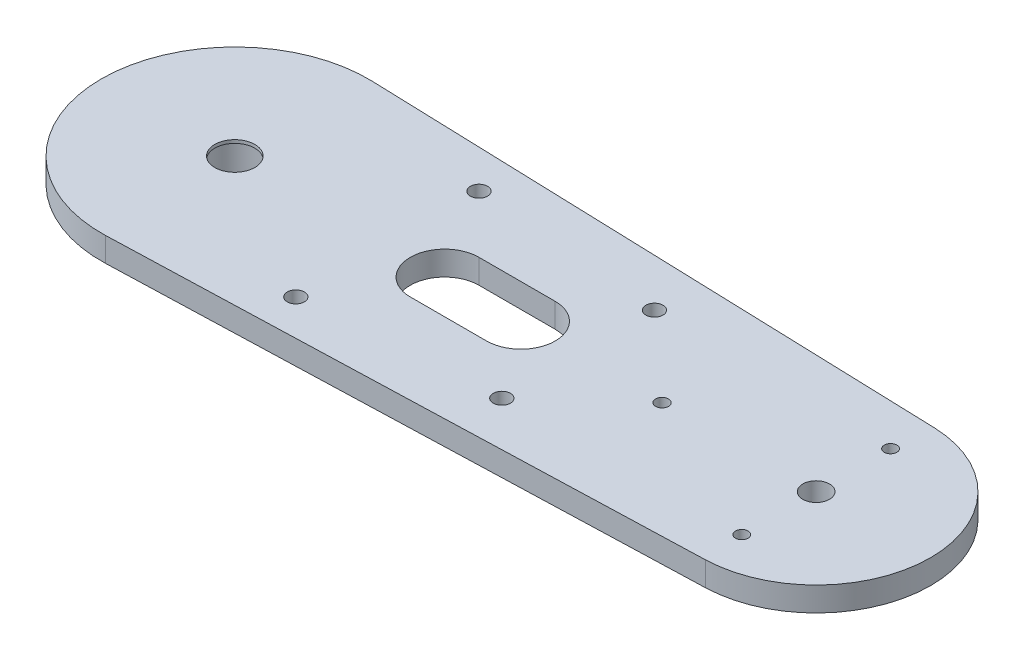
ISO-10303-21;
HEADER;
FILE_DESCRIPTION(('STEP AP214'),'2;1');
FILE_NAME('part.step','',(''),(''),'','','');
FILE_SCHEMA(('AUTOMOTIVE_DESIGN { 1 0 10303 214 1 1 1 1 }'));
ENDSEC;
DATA;
#1=APPLICATION_CONTEXT('core data for automotive mechanical design processes');
#2=APPLICATION_PROTOCOL_DEFINITION('international standard','automotive_design',2000,#1);
#3=PRODUCT_CONTEXT('',#1,'mechanical');
#4=PRODUCT('Part','Part','',(#3));
#5=PRODUCT_RELATED_PRODUCT_CATEGORY('part','',(#4));
#6=PRODUCT_DEFINITION_FORMATION('','',#4);
#7=PRODUCT_DEFINITION_CONTEXT('part definition',#1,'design');
#8=PRODUCT_DEFINITION('design','',#6,#7);
#9=PRODUCT_DEFINITION_SHAPE('','',#8);
#10=(LENGTH_UNIT() NAMED_UNIT(*) SI_UNIT(.MILLI.,.METRE.));
#11=(NAMED_UNIT(*) PLANE_ANGLE_UNIT() SI_UNIT($,.RADIAN.));
#12=(NAMED_UNIT(*) SI_UNIT($,.STERADIAN.) SOLID_ANGLE_UNIT());
#13=UNCERTAINTY_MEASURE_WITH_UNIT(LENGTH_MEASURE(1.E-05),#10,'distance_accuracy_value','');
#14=(GEOMETRIC_REPRESENTATION_CONTEXT(3) GLOBAL_UNCERTAINTY_ASSIGNED_CONTEXT((#13)) GLOBAL_UNIT_ASSIGNED_CONTEXT((#10,
#11,#12)) REPRESENTATION_CONTEXT('',''));
#15=CARTESIAN_POINT('',(0.,0.,0.));
#16=DIRECTION('',(0.,0.,1.));
#17=DIRECTION('',(1.,0.,0.));
#18=AXIS2_PLACEMENT_3D('',#15,#16,#17);
#19=CARTESIAN_POINT('',(0.,-4.,171.45));
#20=DIRECTION('',(0.,-1.,0.));
#21=DIRECTION('',(0.,0.,-1.));
#22=AXIS2_PLACEMENT_3D('',#19,#20,#21);
#23=CYLINDRICAL_SURFACE('',#22,5.25);
#24=CARTESIAN_POINT('',(0.,-4.,171.45));
#25=DIRECTION('',(0.,1.,0.));
#26=DIRECTION('',(0.,0.,1.));
#27=AXIS2_PLACEMENT_3D('',#24,#25,#26);
#28=CIRCLE('',#27,5.25);
#29=CARTESIAN_POINT('',(0.,-4.,176.7));
#30=VERTEX_POINT('',#29);
#31=EDGE_CURVE('E434',#30,#30,#28,.T.);
#32=ORIENTED_EDGE('',*,*,#31,.T.);
#33=EDGE_LOOP('',(#32));
#34=FACE_BOUND('',#33,.T.);
#35=CARTESIAN_POINT('',(0.,-4.85,171.45));
#36=DIRECTION('',(0.,-1.,0.));
#37=DIRECTION('',(0.,0.,-1.));
#38=AXIS2_PLACEMENT_3D('',#35,#36,#37);
#39=CIRCLE('',#38,5.25);
#40=CARTESIAN_POINT('',(0.,-4.85,166.2));
#41=VERTEX_POINT('',#40);
#42=EDGE_CURVE('E43',#41,#41,#39,.T.);
#43=ORIENTED_EDGE('',*,*,#42,.T.);
#44=EDGE_LOOP('',(#43));
#45=FACE_BOUND('',#44,.T.);
#46=ADVANCED_FACE('F39',(#34,#45),#23,.F.);
#47=CARTESIAN_POINT('',(0.,-4.,0.));
#48=DIRECTION('',(0.,1.,0.));
#49=DIRECTION('',(0.,0.,1.));
#50=AXIS2_PLACEMENT_3D('',#47,#48,#49);
#51=PLANE('',#50);
#52=CARTESIAN_POINT('',(112.,-4.,171.45));
#53=DIRECTION('',(0.,1.,0.));
#54=DIRECTION('',(0.,0.,1.));
#55=AXIS2_PLACEMENT_3D('',#52,#53,#54);
#56=CIRCLE('',#55,1.69999999999999);
#57=CARTESIAN_POINT('',(112.,-4.,173.15));
#58=VERTEX_POINT('',#57);
#59=EDGE_CURVE('E429',#58,#58,#56,.T.);
#60=ORIENTED_EDGE('',*,*,#59,.F.);
#61=EDGE_LOOP('',(#60));
#62=FACE_BOUND('',#61,.T.);
#63=ORIENTED_EDGE('',*,*,#31,.F.);
#64=EDGE_LOOP('',(#63));
#65=FACE_BOUND('',#64,.T.);
#66=CARTESIAN_POINT('',(152.4,-4.,171.45));
#67=DIRECTION('',(0.,1.,0.));
#68=DIRECTION('',(0.,0.,1.));
#69=AXIS2_PLACEMENT_3D('',#66,#67,#68);
#70=CIRCLE('',#69,3.49999999999999);
#71=CARTESIAN_POINT('',(152.4,-4.,174.95));
#72=VERTEX_POINT('',#71);
#73=EDGE_CURVE('E445',#72,#72,#70,.T.);
#74=ORIENTED_EDGE('',*,*,#73,.F.);
#75=EDGE_LOOP('',(#74));
#76=FACE_BOUND('',#75,.T.);
#77=CARTESIAN_POINT('',(152.4,-4.,190.95));
#78=DIRECTION('',(0.,1.,0.));
#79=DIRECTION('',(0.,0.,1.));
#80=AXIS2_PLACEMENT_3D('',#77,#78,#79);
#81=CIRCLE('',#80,1.65000000000002);
#82=CARTESIAN_POINT('',(152.4,-4.,192.6));
#83=VERTEX_POINT('',#82);
#84=EDGE_CURVE('E449',#83,#83,#81,.T.);
#85=ORIENTED_EDGE('',*,*,#84,.F.);
#86=EDGE_LOOP('',(#85));
#87=FACE_BOUND('',#86,.T.);
#88=CARTESIAN_POINT('',(152.4,-4.,151.95));
#89=DIRECTION('',(0.,1.,0.));
#90=DIRECTION('',(0.,0.,1.));
#91=AXIS2_PLACEMENT_3D('',#88,#89,#90);
#92=CIRCLE('',#91,1.65000000000002);
#93=CARTESIAN_POINT('',(152.4,-4.,153.6));
#94=VERTEX_POINT('',#93);
#95=EDGE_CURVE('E435',#94,#94,#92,.T.);
#96=ORIENTED_EDGE('',*,*,#95,.F.);
#97=EDGE_LOOP('',(#96));
#98=FACE_BOUND('',#97,.T.);
#99=CARTESIAN_POINT('',(40.,-4.,147.45));
#100=DIRECTION('',(0.,1.,0.));
#101=DIRECTION('',(0.,0.,1.));
#102=AXIS2_PLACEMENT_3D('',#99,#100,#101);
#103=CIRCLE('',#102,2.25);
#104=CARTESIAN_POINT('',(40.,-4.,149.7));
#105=VERTEX_POINT('',#104);
#106=EDGE_CURVE('E467',#105,#105,#103,.T.);
#107=ORIENTED_EDGE('',*,*,#106,.F.);
#108=EDGE_LOOP('',(#107));
#109=FACE_BOUND('',#108,.T.);
#110=CARTESIAN_POINT('',(90.,-4.,191.45));
#111=DIRECTION('',(0.,1.,0.));
#112=DIRECTION('',(0.,0.,1.));
#113=AXIS2_PLACEMENT_3D('',#110,#111,#112);
#114=CIRCLE('',#113,2.25);
#115=CARTESIAN_POINT('',(90.,-4.,193.7));
#116=VERTEX_POINT('',#115);
#117=EDGE_CURVE('E456',#116,#116,#114,.T.);
#118=ORIENTED_EDGE('',*,*,#117,.F.);
#119=EDGE_LOOP('',(#118));
#120=FACE_BOUND('',#119,.T.);
#121=CARTESIAN_POINT('',(90.,-4.,151.45));
#122=DIRECTION('',(0.,1.,0.));
#123=DIRECTION('',(0.,0.,1.));
#124=AXIS2_PLACEMENT_3D('',#121,#122,#123);
#125=CIRCLE('',#124,2.25);
#126=CARTESIAN_POINT('',(90.,-4.,153.7));
#127=VERTEX_POINT('',#126);
#128=EDGE_CURVE('E438',#127,#127,#125,.T.);
#129=ORIENTED_EDGE('',*,*,#128,.F.);
#130=EDGE_LOOP('',(#129));
#131=FACE_BOUND('',#130,.T.);
#132=CARTESIAN_POINT('',(40.,-4.,195.45));
#133=DIRECTION('',(0.,1.,0.));
#134=DIRECTION('',(0.,0.,1.));
#135=AXIS2_PLACEMENT_3D('',#132,#133,#134);
#136=CIRCLE('',#135,2.25);
#137=CARTESIAN_POINT('',(40.,-4.,197.7));
#138=VERTEX_POINT('',#137);
#139=EDGE_CURVE('E133',#138,#138,#136,.T.);
#140=ORIENTED_EDGE('',*,*,#139,.F.);
#141=EDGE_LOOP('',(#140));
#142=FACE_BOUND('',#141,.T.);
#143=DIRECTION('',(0.999461659573957,0.,-0.0328083989501311));
#144=VECTOR('',#143,1.);
#145=CARTESIAN_POINT('',(1.14829396325459,-4.,206.431158085088));
#146=LINE('',#145,#144);
#147=CARTESIAN_POINT('',(1.14829396325459,-4.,206.431158085088));
#148=VERTEX_POINT('',#147);
#149=CARTESIAN_POINT('',(153.384251968504,-4.,201.433849787219));
#150=VERTEX_POINT('',#149);
#151=EDGE_CURVE('E157',#148,#150,#146,.T.);
#152=ORIENTED_EDGE('',*,*,#151,.T.);
#153=CARTESIAN_POINT('',(152.4,-4.,171.45));
#154=DIRECTION('',(0.,1.,0.));
#155=DIRECTION('',(0.,0.,1.));
#156=AXIS2_PLACEMENT_3D('',#153,#154,#155);
#157=CIRCLE('',#156,30.);
#158=CARTESIAN_POINT('',(153.384251968504,-4.,141.466150212781));
#159=VERTEX_POINT('',#158);
#160=EDGE_CURVE('E143',#150,#159,#157,.T.);
#161=ORIENTED_EDGE('',*,*,#160,.T.);
#162=DIRECTION('',(-0.999461659573957,0.,-0.0328083989501311));
#163=VECTOR('',#162,1.);
#164=CARTESIAN_POINT('',(153.384251968504,-4.,141.466150212781));
#165=LINE('',#164,#163);
#166=CARTESIAN_POINT('',(1.14829396325459,-4.,136.468841914911));
#167=VERTEX_POINT('',#166);
#168=EDGE_CURVE('E156',#159,#167,#165,.T.);
#169=ORIENTED_EDGE('',*,*,#168,.T.);
#170=CARTESIAN_POINT('',(0.,-4.,171.45));
#171=DIRECTION('',(0.,1.,0.));
#172=DIRECTION('',(0.,0.,1.));
#173=AXIS2_PLACEMENT_3D('',#170,#171,#172);
#174=CIRCLE('',#173,35.);
#175=EDGE_CURVE('E146',#167,#148,#174,.T.);
#176=ORIENTED_EDGE('',*,*,#175,.T.);
#177=EDGE_LOOP('',(#152,#161,#169,#176));
#178=FACE_BOUND('',#177,.T.);
#179=DIRECTION('',(1.,0.,0.));
#180=VECTOR('',#179,1.);
#181=CARTESIAN_POINT('',(75.,-4.,180.45));
#182=LINE('',#181,#180);
#183=CARTESIAN_POINT('',(55.,-4.,180.45));
#184=VERTEX_POINT('',#183);
#185=CARTESIAN_POINT('',(75.,-4.,180.45));
#186=VERTEX_POINT('',#185);
#187=EDGE_CURVE('E112',#184,#186,#182,.T.);
#188=ORIENTED_EDGE('',*,*,#187,.F.);
#189=CARTESIAN_POINT('',(55.,-4.,171.45));
#190=DIRECTION('',(0.,1.,0.));
#191=DIRECTION('',(0.,0.,-1.));
#192=AXIS2_PLACEMENT_3D('',#189,#190,#191);
#193=CIRCLE('',#192,9.00000000000001);
#194=CARTESIAN_POINT('',(55.,-4.,162.45));
#195=VERTEX_POINT('',#194);
#196=EDGE_CURVE('E106',#195,#184,#193,.T.);
#197=ORIENTED_EDGE('',*,*,#196,.F.);
#198=DIRECTION('',(-1.,0.,0.));
#199=VECTOR('',#198,1.);
#200=CARTESIAN_POINT('',(55.,-4.,162.45));
#201=LINE('',#200,#199);
#202=CARTESIAN_POINT('',(75.,-4.,162.45));
#203=VERTEX_POINT('',#202);
#204=EDGE_CURVE('E130',#203,#195,#201,.T.);
#205=ORIENTED_EDGE('',*,*,#204,.F.);
#206=CARTESIAN_POINT('',(75.,-4.,171.45));
#207=DIRECTION('',(0.,1.,0.));
#208=DIRECTION('',(0.,0.,-1.));
#209=AXIS2_PLACEMENT_3D('',#206,#207,#208);
#210=CIRCLE('',#209,9.00000000000001);
#211=EDGE_CURVE('E129',#186,#203,#210,.T.);
#212=ORIENTED_EDGE('',*,*,#211,.F.);
#213=EDGE_LOOP('',(#188,#197,#205,#212));
#214=FACE_BOUND('',#213,.T.);
#215=ADVANCED_FACE('F128',(#62,#65,#76,#87,#98,#109,#120,#131,#142,#178,#214),#51,.T.);
#216=CARTESIAN_POINT('',(0.,-10.35,0.));
#217=DIRECTION('',(0.,1.,0.));
#218=DIRECTION('',(0.,0.,1.));
#219=AXIS2_PLACEMENT_3D('',#216,#217,#218);
#220=PLANE('',#219);
#221=CARTESIAN_POINT('',(0.,-10.35,171.45));
#222=DIRECTION('',(0.,-1.,0.));
#223=DIRECTION('',(0.,0.,-1.));
#224=AXIS2_PLACEMENT_3D('',#221,#222,#223);
#225=CIRCLE('',#224,10.);
#226=CARTESIAN_POINT('',(0.,-10.35,161.45));
#227=VERTEX_POINT('',#226);
#228=EDGE_CURVE('E11',#227,#227,#225,.T.);
#229=ORIENTED_EDGE('',*,*,#228,.F.);
#230=EDGE_LOOP('',(#229));
#231=FACE_BOUND('',#230,.T.);
#232=CARTESIAN_POINT('',(112.,-10.35,171.45));
#233=DIRECTION('',(0.,1.,0.));
#234=DIRECTION('',(0.,0.,1.));
#235=AXIS2_PLACEMENT_3D('',#232,#233,#234);
#236=CIRCLE('',#235,1.69999999999999);
#237=CARTESIAN_POINT('',(112.,-10.35,173.15));
#238=VERTEX_POINT('',#237);
#239=EDGE_CURVE('E430',#238,#238,#236,.T.);
#240=ORIENTED_EDGE('',*,*,#239,.T.);
#241=EDGE_LOOP('',(#240));
#242=FACE_BOUND('',#241,.T.);
#243=CARTESIAN_POINT('',(152.4,-10.35,171.45));
#244=DIRECTION('',(0.,1.,0.));
#245=DIRECTION('',(0.,0.,1.));
#246=AXIS2_PLACEMENT_3D('',#243,#244,#245);
#247=CIRCLE('',#246,3.49999999999999);
#248=CARTESIAN_POINT('',(152.4,-10.35,174.95));
#249=VERTEX_POINT('',#248);
#250=EDGE_CURVE('E437',#249,#249,#247,.T.);
#251=ORIENTED_EDGE('',*,*,#250,.T.);
#252=EDGE_LOOP('',(#251));
#253=FACE_BOUND('',#252,.T.);
#254=CARTESIAN_POINT('',(152.4,-10.35,190.95));
#255=DIRECTION('',(0.,1.,0.));
#256=DIRECTION('',(0.,0.,1.));
#257=AXIS2_PLACEMENT_3D('',#254,#255,#256);
#258=CIRCLE('',#257,1.65000000000002);
#259=CARTESIAN_POINT('',(152.4,-10.35,192.6));
#260=VERTEX_POINT('',#259);
#261=EDGE_CURVE('E444',#260,#260,#258,.T.);
#262=ORIENTED_EDGE('',*,*,#261,.T.);
#263=EDGE_LOOP('',(#262));
#264=FACE_BOUND('',#263,.T.);
#265=CARTESIAN_POINT('',(152.4,-10.35,151.95));
#266=DIRECTION('',(0.,1.,0.));
#267=DIRECTION('',(0.,0.,1.));
#268=AXIS2_PLACEMENT_3D('',#265,#266,#267);
#269=CIRCLE('',#268,1.65000000000002);
#270=CARTESIAN_POINT('',(152.4,-10.35,153.6));
#271=VERTEX_POINT('',#270);
#272=EDGE_CURVE('E453',#271,#271,#269,.T.);
#273=ORIENTED_EDGE('',*,*,#272,.T.);
#274=EDGE_LOOP('',(#273));
#275=FACE_BOUND('',#274,.T.);
#276=CARTESIAN_POINT('',(40.,-10.35,147.45));
#277=DIRECTION('',(0.,1.,0.));
#278=DIRECTION('',(0.,0.,1.));
#279=AXIS2_PLACEMENT_3D('',#276,#277,#278);
#280=CIRCLE('',#279,2.25);
#281=CARTESIAN_POINT('',(40.,-10.35,149.7));
#282=VERTEX_POINT('',#281);
#283=EDGE_CURVE('E465',#282,#282,#280,.T.);
#284=ORIENTED_EDGE('',*,*,#283,.T.);
#285=EDGE_LOOP('',(#284));
#286=FACE_BOUND('',#285,.T.);
#287=CARTESIAN_POINT('',(90.,-10.35,191.45));
#288=DIRECTION('',(0.,1.,0.));
#289=DIRECTION('',(0.,0.,1.));
#290=AXIS2_PLACEMENT_3D('',#287,#288,#289);
#291=CIRCLE('',#290,2.25);
#292=CARTESIAN_POINT('',(90.,-10.35,193.7));
#293=VERTEX_POINT('',#292);
#294=EDGE_CURVE('E469',#293,#293,#291,.T.);
#295=ORIENTED_EDGE('',*,*,#294,.T.);
#296=EDGE_LOOP('',(#295));
#297=FACE_BOUND('',#296,.T.);
#298=CARTESIAN_POINT('',(90.,-10.35,151.45));
#299=DIRECTION('',(0.,1.,0.));
#300=DIRECTION('',(0.,0.,1.));
#301=AXIS2_PLACEMENT_3D('',#298,#299,#300);
#302=CIRCLE('',#301,2.25);
#303=CARTESIAN_POINT('',(90.,-10.35,153.7));
#304=VERTEX_POINT('',#303);
#305=EDGE_CURVE('E457',#304,#304,#302,.T.);
#306=ORIENTED_EDGE('',*,*,#305,.T.);
#307=EDGE_LOOP('',(#306));
#308=FACE_BOUND('',#307,.T.);
#309=CARTESIAN_POINT('',(40.,-10.35,195.45));
#310=DIRECTION('',(0.,1.,0.));
#311=DIRECTION('',(0.,0.,1.));
#312=AXIS2_PLACEMENT_3D('',#309,#310,#311);
#313=CIRCLE('',#312,2.25);
#314=CARTESIAN_POINT('',(40.,-10.35,197.7));
#315=VERTEX_POINT('',#314);
#316=EDGE_CURVE('E463',#315,#315,#313,.T.);
#317=ORIENTED_EDGE('',*,*,#316,.T.);
#318=EDGE_LOOP('',(#317));
#319=FACE_BOUND('',#318,.T.);
#320=DIRECTION('',(-0.999461659573957,0.,-0.0328083989501311));
#321=VECTOR('',#320,1.);
#322=CARTESIAN_POINT('',(153.384251968504,-10.35,141.466150212781));
#323=LINE('',#322,#321);
#324=CARTESIAN_POINT('',(153.384251968504,-10.35,141.466150212781));
#325=VERTEX_POINT('',#324);
#326=CARTESIAN_POINT('',(1.14829396325459,-10.35,136.468841914911));
#327=VERTEX_POINT('',#326);
#328=EDGE_CURVE('E158',#325,#327,#323,.T.);
#329=ORIENTED_EDGE('',*,*,#328,.F.);
#330=CARTESIAN_POINT('',(152.4,-10.35,171.45));
#331=DIRECTION('',(0.,1.,0.));
#332=DIRECTION('',(0.,0.,1.));
#333=AXIS2_PLACEMENT_3D('',#330,#331,#332);
#334=CIRCLE('',#333,30.);
#335=CARTESIAN_POINT('',(153.384251968504,-10.35,201.433849787219));
#336=VERTEX_POINT('',#335);
#337=EDGE_CURVE('E125',#336,#325,#334,.T.);
#338=ORIENTED_EDGE('',*,*,#337,.F.);
#339=DIRECTION('',(0.999461659573957,0.,-0.0328083989501311));
#340=VECTOR('',#339,1.);
#341=CARTESIAN_POINT('',(1.14829396325459,-10.35,206.431158085088));
#342=LINE('',#341,#340);
#343=CARTESIAN_POINT('',(1.14829396325459,-10.35,206.431158085088));
#344=VERTEX_POINT('',#343);
#345=EDGE_CURVE('E154',#344,#336,#342,.T.);
#346=ORIENTED_EDGE('',*,*,#345,.F.);
#347=CARTESIAN_POINT('',(0.,-10.35,171.45));
#348=DIRECTION('',(0.,1.,0.));
#349=DIRECTION('',(0.,0.,1.));
#350=AXIS2_PLACEMENT_3D('',#347,#348,#349);
#351=CIRCLE('',#350,35.);
#352=EDGE_CURVE('E147',#327,#344,#351,.T.);
#353=ORIENTED_EDGE('',*,*,#352,.F.);
#354=EDGE_LOOP('',(#329,#338,#346,#353));
#355=FACE_BOUND('',#354,.T.);
#356=CARTESIAN_POINT('',(55.,-10.35,171.45));
#357=DIRECTION('',(0.,1.,0.));
#358=DIRECTION('',(0.,0.,-1.));
#359=AXIS2_PLACEMENT_3D('',#356,#357,#358);
#360=CIRCLE('',#359,9.00000000000001);
#361=CARTESIAN_POINT('',(55.,-10.35,162.45));
#362=VERTEX_POINT('',#361);
#363=CARTESIAN_POINT('',(55.,-10.35,180.45));
#364=VERTEX_POINT('',#363);
#365=EDGE_CURVE('E65',#362,#364,#360,.T.);
#366=ORIENTED_EDGE('',*,*,#365,.T.);
#367=DIRECTION('',(1.,0.,0.));
#368=VECTOR('',#367,1.);
#369=CARTESIAN_POINT('',(75.,-10.35,180.45));
#370=LINE('',#369,#368);
#371=CARTESIAN_POINT('',(75.,-10.35,180.45));
#372=VERTEX_POINT('',#371);
#373=EDGE_CURVE('E122',#364,#372,#370,.T.);
#374=ORIENTED_EDGE('',*,*,#373,.T.);
#375=CARTESIAN_POINT('',(75.,-10.35,171.45));
#376=DIRECTION('',(0.,1.,0.));
#377=DIRECTION('',(0.,0.,-1.));
#378=AXIS2_PLACEMENT_3D('',#375,#376,#377);
#379=CIRCLE('',#378,9.00000000000001);
#380=CARTESIAN_POINT('',(75.,-10.35,162.45));
#381=VERTEX_POINT('',#380);
#382=EDGE_CURVE('E140',#372,#381,#379,.T.);
#383=ORIENTED_EDGE('',*,*,#382,.T.);
#384=DIRECTION('',(-1.,0.,0.));
#385=VECTOR('',#384,1.);
#386=CARTESIAN_POINT('',(55.,-10.35,162.45));
#387=LINE('',#386,#385);
#388=EDGE_CURVE('E114',#381,#362,#387,.T.);
#389=ORIENTED_EDGE('',*,*,#388,.T.);
#390=EDGE_LOOP('',(#366,#374,#383,#389));
#391=FACE_BOUND('',#390,.T.);
#392=ADVANCED_FACE('F182',(#231,#242,#253,#264,#275,#286,#297,#308,#319,#355,#391),#220,.F.);
#393=CARTESIAN_POINT('',(1.14829396325459,-4.,206.431158085088));
#394=DIRECTION('',(-0.0328083989501311,0.,-0.999461659573957));
#395=DIRECTION('',(-0.999461659573957,0.,0.0328083989501311));
#396=AXIS2_PLACEMENT_3D('',#393,#394,#395);
#397=PLANE('',#396);
#398=ORIENTED_EDGE('',*,*,#345,.T.);
#399=DIRECTION('',(0.,-1.,0.));
#400=VECTOR('',#399,1.);
#401=CARTESIAN_POINT('',(153.384251968504,-4.,201.433849787219));
#402=LINE('',#401,#400);
#403=EDGE_CURVE('E171',#150,#336,#402,.T.);
#404=ORIENTED_EDGE('',*,*,#403,.F.);
#405=ORIENTED_EDGE('',*,*,#151,.F.);
#406=DIRECTION('',(0.,-1.,0.));
#407=VECTOR('',#406,1.);
#408=CARTESIAN_POINT('',(1.14829396325459,-4.,206.431158085088));
#409=LINE('',#408,#407);
#410=EDGE_CURVE('E48',#148,#344,#409,.T.);
#411=ORIENTED_EDGE('',*,*,#410,.T.);
#412=EDGE_LOOP('',(#398,#404,#405,#411));
#413=FACE_BOUND('',#412,.T.);
#414=ADVANCED_FACE('F41',(#413),#397,.F.);
#415=CARTESIAN_POINT('',(153.384251968504,-4.,141.466150212781));
#416=DIRECTION('',(-0.0328083989501311,0.,0.999461659573957));
#417=DIRECTION('',(0.999461659573957,0.,0.0328083989501311));
#418=AXIS2_PLACEMENT_3D('',#415,#416,#417);
#419=PLANE('',#418);
#420=ORIENTED_EDGE('',*,*,#328,.T.);
#421=DIRECTION('',(0.,-1.,0.));
#422=VECTOR('',#421,1.);
#423=CARTESIAN_POINT('',(1.14829396325459,-4.,136.468841914911));
#424=LINE('',#423,#422);
#425=EDGE_CURVE('E162',#167,#327,#424,.T.);
#426=ORIENTED_EDGE('',*,*,#425,.F.);
#427=ORIENTED_EDGE('',*,*,#168,.F.);
#428=DIRECTION('',(0.,-1.,0.));
#429=VECTOR('',#428,1.);
#430=CARTESIAN_POINT('',(153.384251968504,-4.,141.466150212781));
#431=LINE('',#430,#429);
#432=EDGE_CURVE('E166',#159,#325,#431,.T.);
#433=ORIENTED_EDGE('',*,*,#432,.T.);
#434=EDGE_LOOP('',(#420,#426,#427,#433));
#435=FACE_BOUND('',#434,.T.);
#436=ADVANCED_FACE('F188',(#435),#419,.F.);
#437=CARTESIAN_POINT('',(0.,-4.,171.45));
#438=DIRECTION('',(0.,-1.,0.));
#439=DIRECTION('',(0.,0.,-1.));
#440=AXIS2_PLACEMENT_3D('',#437,#438,#439);
#441=CYLINDRICAL_SURFACE('',#440,35.);
#442=ORIENTED_EDGE('',*,*,#352,.T.);
#443=ORIENTED_EDGE('',*,*,#410,.F.);
#444=ORIENTED_EDGE('',*,*,#175,.F.);
#445=ORIENTED_EDGE('',*,*,#425,.T.);
#446=EDGE_LOOP('',(#442,#443,#444,#445));
#447=FACE_BOUND('',#446,.T.);
#448=ADVANCED_FACE('F177',(#447),#441,.T.);
#449=CARTESIAN_POINT('',(152.4,-4.,171.45));
#450=DIRECTION('',(0.,-1.,0.));
#451=DIRECTION('',(0.,0.,-1.));
#452=AXIS2_PLACEMENT_3D('',#449,#450,#451);
#453=CYLINDRICAL_SURFACE('',#452,30.);
#454=ORIENTED_EDGE('',*,*,#160,.F.);
#455=ORIENTED_EDGE('',*,*,#403,.T.);
#456=ORIENTED_EDGE('',*,*,#337,.T.);
#457=ORIENTED_EDGE('',*,*,#432,.F.);
#458=EDGE_LOOP('',(#454,#455,#456,#457));
#459=FACE_BOUND('',#458,.T.);
#460=ADVANCED_FACE('F190',(#459),#453,.T.);
#461=CARTESIAN_POINT('',(55.,-4.,171.45));
#462=DIRECTION('',(0.,-1.,0.));
#463=DIRECTION('',(0.,0.,-1.));
#464=AXIS2_PLACEMENT_3D('',#461,#462,#463);
#465=CYLINDRICAL_SURFACE('',#464,9.00000000000001);
#466=ORIENTED_EDGE('',*,*,#365,.F.);
#467=DIRECTION('',(0.,-1.,0.));
#468=VECTOR('',#467,1.);
#469=CARTESIAN_POINT('',(55.,-4.,162.45));
#470=LINE('',#469,#468);
#471=EDGE_CURVE('E109',#195,#362,#470,.T.);
#472=ORIENTED_EDGE('',*,*,#471,.F.);
#473=ORIENTED_EDGE('',*,*,#196,.T.);
#474=DIRECTION('',(0.,-1.,0.));
#475=VECTOR('',#474,1.);
#476=CARTESIAN_POINT('',(55.,-4.,180.45));
#477=LINE('',#476,#475);
#478=EDGE_CURVE('E107',#184,#364,#477,.T.);
#479=ORIENTED_EDGE('',*,*,#478,.T.);
#480=EDGE_LOOP('',(#466,#472,#473,#479));
#481=FACE_BOUND('',#480,.T.);
#482=ADVANCED_FACE('F108',(#481),#465,.F.);
#483=CARTESIAN_POINT('',(75.,-4.,180.45));
#484=DIRECTION('',(0.,0.,-1.));
#485=DIRECTION('',(-1.,0.,0.));
#486=AXIS2_PLACEMENT_3D('',#483,#484,#485);
#487=PLANE('',#486);
#488=ORIENTED_EDGE('',*,*,#373,.F.);
#489=ORIENTED_EDGE('',*,*,#478,.F.);
#490=ORIENTED_EDGE('',*,*,#187,.T.);
#491=DIRECTION('',(0.,-1.,0.));
#492=VECTOR('',#491,1.);
#493=CARTESIAN_POINT('',(75.,-4.,180.45));
#494=LINE('',#493,#492);
#495=EDGE_CURVE('E124',#186,#372,#494,.T.);
#496=ORIENTED_EDGE('',*,*,#495,.T.);
#497=EDGE_LOOP('',(#488,#489,#490,#496));
#498=FACE_BOUND('',#497,.T.);
#499=ADVANCED_FACE('F117',(#498),#487,.T.);
#500=CARTESIAN_POINT('',(75.,-4.,171.45));
#501=DIRECTION('',(0.,-1.,0.));
#502=DIRECTION('',(0.,0.,-1.));
#503=AXIS2_PLACEMENT_3D('',#500,#501,#502);
#504=CYLINDRICAL_SURFACE('',#503,9.00000000000001);
#505=ORIENTED_EDGE('',*,*,#382,.F.);
#506=ORIENTED_EDGE('',*,*,#495,.F.);
#507=ORIENTED_EDGE('',*,*,#211,.T.);
#508=DIRECTION('',(0.,-1.,0.));
#509=VECTOR('',#508,1.);
#510=CARTESIAN_POINT('',(75.,-4.,162.45));
#511=LINE('',#510,#509);
#512=EDGE_CURVE('E57',#203,#381,#511,.T.);
#513=ORIENTED_EDGE('',*,*,#512,.T.);
#514=EDGE_LOOP('',(#505,#506,#507,#513));
#515=FACE_BOUND('',#514,.T.);
#516=ADVANCED_FACE('F268',(#515),#504,.F.);
#517=CARTESIAN_POINT('',(55.,-4.,162.45));
#518=DIRECTION('',(0.,0.,1.));
#519=DIRECTION('',(1.,0.,0.));
#520=AXIS2_PLACEMENT_3D('',#517,#518,#519);
#521=PLANE('',#520);
#522=ORIENTED_EDGE('',*,*,#388,.F.);
#523=ORIENTED_EDGE('',*,*,#512,.F.);
#524=ORIENTED_EDGE('',*,*,#204,.T.);
#525=ORIENTED_EDGE('',*,*,#471,.T.);
#526=EDGE_LOOP('',(#522,#523,#524,#525));
#527=FACE_BOUND('',#526,.T.);
#528=ADVANCED_FACE('F280',(#527),#521,.T.);
#529=CARTESIAN_POINT('',(40.,-4.,195.45));
#530=DIRECTION('',(0.,-1.,0.));
#531=DIRECTION('',(0.,0.,-1.));
#532=AXIS2_PLACEMENT_3D('',#529,#530,#531);
#533=CYLINDRICAL_SURFACE('',#532,2.25);
#534=ORIENTED_EDGE('',*,*,#139,.T.);
#535=EDGE_LOOP('',(#534));
#536=FACE_BOUND('',#535,.T.);
#537=ORIENTED_EDGE('',*,*,#316,.F.);
#538=EDGE_LOOP('',(#537));
#539=FACE_BOUND('',#538,.T.);
#540=ADVANCED_FACE('F286',(#536,#539),#533,.F.);
#541=CARTESIAN_POINT('',(90.,-4.,151.45));
#542=DIRECTION('',(0.,-1.,0.));
#543=DIRECTION('',(0.,0.,-1.));
#544=AXIS2_PLACEMENT_3D('',#541,#542,#543);
#545=CYLINDRICAL_SURFACE('',#544,2.25);
#546=ORIENTED_EDGE('',*,*,#128,.T.);
#547=EDGE_LOOP('',(#546));
#548=FACE_BOUND('',#547,.T.);
#549=ORIENTED_EDGE('',*,*,#305,.F.);
#550=EDGE_LOOP('',(#549));
#551=FACE_BOUND('',#550,.T.);
#552=ADVANCED_FACE('F296',(#548,#551),#545,.F.);
#553=CARTESIAN_POINT('',(90.,-4.,191.45));
#554=DIRECTION('',(0.,-1.,0.));
#555=DIRECTION('',(0.,0.,-1.));
#556=AXIS2_PLACEMENT_3D('',#553,#554,#555);
#557=CYLINDRICAL_SURFACE('',#556,2.25);
#558=ORIENTED_EDGE('',*,*,#117,.T.);
#559=EDGE_LOOP('',(#558));
#560=FACE_BOUND('',#559,.T.);
#561=ORIENTED_EDGE('',*,*,#294,.F.);
#562=EDGE_LOOP('',(#561));
#563=FACE_BOUND('',#562,.T.);
#564=ADVANCED_FACE('F308',(#560,#563),#557,.F.);
#565=CARTESIAN_POINT('',(40.,-4.,147.45));
#566=DIRECTION('',(0.,-1.,0.));
#567=DIRECTION('',(0.,0.,-1.));
#568=AXIS2_PLACEMENT_3D('',#565,#566,#567);
#569=CYLINDRICAL_SURFACE('',#568,2.25);
#570=ORIENTED_EDGE('',*,*,#106,.T.);
#571=EDGE_LOOP('',(#570));
#572=FACE_BOUND('',#571,.T.);
#573=ORIENTED_EDGE('',*,*,#283,.F.);
#574=EDGE_LOOP('',(#573));
#575=FACE_BOUND('',#574,.T.);
#576=ADVANCED_FACE('F319',(#572,#575),#569,.F.);
#577=CARTESIAN_POINT('',(152.4,-4.,151.95));
#578=DIRECTION('',(0.,-1.,0.));
#579=DIRECTION('',(0.,0.,-1.));
#580=AXIS2_PLACEMENT_3D('',#577,#578,#579);
#581=CYLINDRICAL_SURFACE('',#580,1.65000000000002);
#582=ORIENTED_EDGE('',*,*,#95,.T.);
#583=EDGE_LOOP('',(#582));
#584=FACE_BOUND('',#583,.T.);
#585=ORIENTED_EDGE('',*,*,#272,.F.);
#586=EDGE_LOOP('',(#585));
#587=FACE_BOUND('',#586,.T.);
#588=ADVANCED_FACE('F329',(#584,#587),#581,.F.);
#589=CARTESIAN_POINT('',(152.4,-4.,190.95));
#590=DIRECTION('',(0.,-1.,0.));
#591=DIRECTION('',(0.,0.,-1.));
#592=AXIS2_PLACEMENT_3D('',#589,#590,#591);
#593=CYLINDRICAL_SURFACE('',#592,1.65000000000002);
#594=ORIENTED_EDGE('',*,*,#84,.T.);
#595=EDGE_LOOP('',(#594));
#596=FACE_BOUND('',#595,.T.);
#597=ORIENTED_EDGE('',*,*,#261,.F.);
#598=EDGE_LOOP('',(#597));
#599=FACE_BOUND('',#598,.T.);
#600=ADVANCED_FACE('F336',(#596,#599),#593,.F.);
#601=CARTESIAN_POINT('',(152.4,-4.,171.45));
#602=DIRECTION('',(0.,-1.,0.));
#603=DIRECTION('',(0.,0.,-1.));
#604=AXIS2_PLACEMENT_3D('',#601,#602,#603);
#605=CYLINDRICAL_SURFACE('',#604,3.49999999999999);
#606=ORIENTED_EDGE('',*,*,#73,.T.);
#607=EDGE_LOOP('',(#606));
#608=FACE_BOUND('',#607,.T.);
#609=ORIENTED_EDGE('',*,*,#250,.F.);
#610=EDGE_LOOP('',(#609));
#611=FACE_BOUND('',#610,.T.);
#612=ADVANCED_FACE('F349',(#608,#611),#605,.F.);
#613=CARTESIAN_POINT('',(112.,-4.,171.45));
#614=DIRECTION('',(0.,-1.,0.));
#615=DIRECTION('',(0.,0.,-1.));
#616=AXIS2_PLACEMENT_3D('',#613,#614,#615);
#617=CYLINDRICAL_SURFACE('',#616,1.69999999999999);
#618=ORIENTED_EDGE('',*,*,#59,.T.);
#619=EDGE_LOOP('',(#618));
#620=FACE_BOUND('',#619,.T.);
#621=ORIENTED_EDGE('',*,*,#239,.F.);
#622=EDGE_LOOP('',(#621));
#623=FACE_BOUND('',#622,.T.);
#624=ADVANCED_FACE('F357',(#620,#623),#617,.F.);
#625=CARTESIAN_POINT('',(0.,-14.85,171.45));
#626=DIRECTION('',(0.,-1.,0.));
#627=DIRECTION('',(0.,0.,-1.));
#628=AXIS2_PLACEMENT_3D('',#625,#626,#627);
#629=PLANE('',#628);
#630=CARTESIAN_POINT('',(0.,-14.85,171.45));
#631=DIRECTION('',(0.,-1.,0.));
#632=DIRECTION('',(0.,0.,-1.));
#633=AXIS2_PLACEMENT_3D('',#630,#631,#632);
#634=CIRCLE('',#633,7.475);
#635=CARTESIAN_POINT('',(0.,-14.85,163.975));
#636=VERTEX_POINT('',#635);
#637=EDGE_CURVE('E418',#636,#636,#634,.T.);
#638=ORIENTED_EDGE('',*,*,#637,.F.);
#639=EDGE_LOOP('',(#638));
#640=FACE_BOUND('',#639,.T.);
#641=CARTESIAN_POINT('',(0.,-14.85,171.45));
#642=DIRECTION('',(0.,-1.,0.));
#643=DIRECTION('',(0.,0.,-1.));
#644=AXIS2_PLACEMENT_3D('',#641,#642,#643);
#645=CIRCLE('',#644,10.);
#646=CARTESIAN_POINT('',(0.,-14.85,161.45));
#647=VERTEX_POINT('',#646);
#648=EDGE_CURVE('E422',#647,#647,#645,.T.);
#649=ORIENTED_EDGE('',*,*,#648,.T.);
#650=EDGE_LOOP('',(#649));
#651=FACE_BOUND('',#650,.T.);
#652=ADVANCED_FACE('F366',(#640,#651),#629,.T.);
#653=CARTESIAN_POINT('',(0.,-14.85,171.45));
#654=DIRECTION('',(0.,1.,0.));
#655=DIRECTION('',(0.,0.,1.));
#656=AXIS2_PLACEMENT_3D('',#653,#654,#655);
#657=CYLINDRICAL_SURFACE('',#656,10.);
#658=ORIENTED_EDGE('',*,*,#648,.F.);
#659=EDGE_LOOP('',(#658));
#660=FACE_BOUND('',#659,.T.);
#661=ORIENTED_EDGE('',*,*,#228,.T.);
#662=EDGE_LOOP('',(#661));
#663=FACE_BOUND('',#662,.T.);
#664=ADVANCED_FACE('F376',(#660,#663),#657,.T.);
#665=CARTESIAN_POINT('',(0.,-4.85,171.45));
#666=DIRECTION('',(0.,-1.,0.));
#667=DIRECTION('',(0.,0.,-1.));
#668=AXIS2_PLACEMENT_3D('',#665,#666,#667);
#669=CYLINDRICAL_SURFACE('',#668,7.475);
#670=CARTESIAN_POINT('',(0.,-4.85,171.45));
#671=DIRECTION('',(0.,-1.,0.));
#672=DIRECTION('',(0.,0.,-1.));
#673=AXIS2_PLACEMENT_3D('',#670,#671,#672);
#674=CIRCLE('',#673,7.475);
#675=CARTESIAN_POINT('',(0.,-4.85,163.975));
#676=VERTEX_POINT('',#675);
#677=EDGE_CURVE('E416',#676,#676,#674,.T.);
#678=ORIENTED_EDGE('',*,*,#677,.F.);
#679=EDGE_LOOP('',(#678));
#680=FACE_BOUND('',#679,.T.);
#681=ORIENTED_EDGE('',*,*,#637,.T.);
#682=EDGE_LOOP('',(#681));
#683=FACE_BOUND('',#682,.T.);
#684=ADVANCED_FACE('F389',(#680,#683),#669,.F.);
#685=CARTESIAN_POINT('',(0.,-4.85,171.45));
#686=DIRECTION('',(0.,-1.,0.));
#687=DIRECTION('',(0.,0.,-1.));
#688=AXIS2_PLACEMENT_3D('',#685,#686,#687);
#689=PLANE('',#688);
#690=ORIENTED_EDGE('',*,*,#42,.F.);
#691=EDGE_LOOP('',(#690));
#692=FACE_BOUND('',#691,.T.);
#693=ORIENTED_EDGE('',*,*,#677,.T.);
#694=EDGE_LOOP('',(#693));
#695=FACE_BOUND('',#694,.T.);
#696=ADVANCED_FACE('F402',(#692,#695),#689,.T.);
#697=CLOSED_SHELL('',(#46,#215,#392,#414,#436,#448,#460,#482,#499,#516,#528,#540,#552,#564,#576,
#588,#600,#612,#624,#652,#664,#684,#696));
#698=MANIFOLD_SOLID_BREP('B2',#697);
#699=ADVANCED_BREP_SHAPE_REPRESENTATION('',(#18,#698),#14);
#700=SHAPE_DEFINITION_REPRESENTATION(#9,#699);
ENDSEC;
END-ISO-10303-21;
